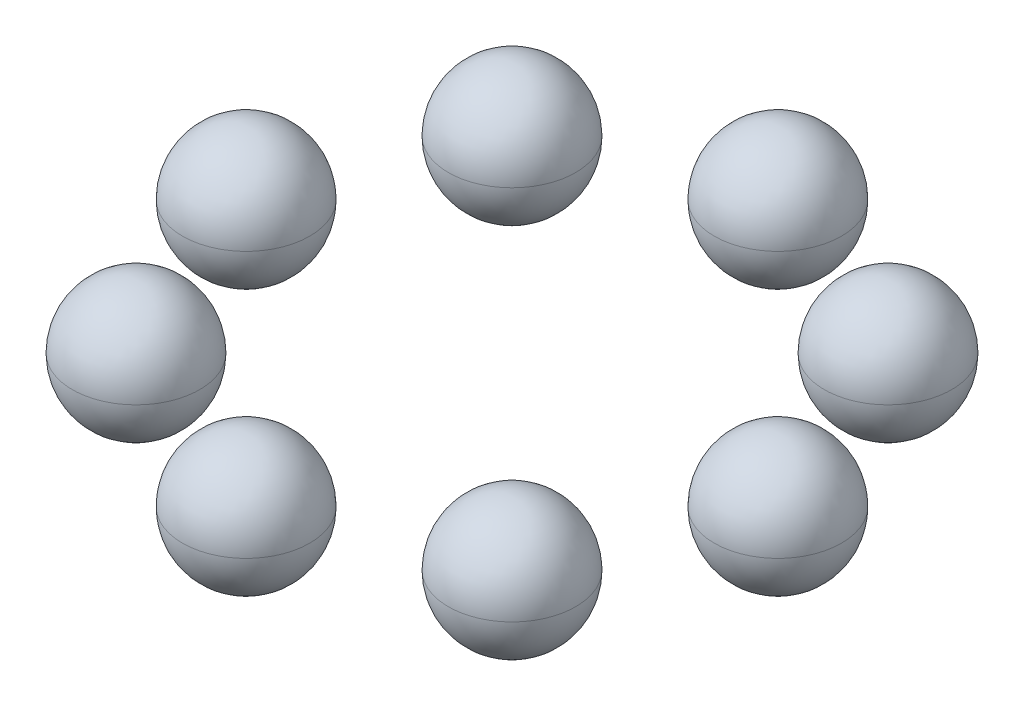
ISO-10303-21;
HEADER;
FILE_DESCRIPTION(('STEP AP214'),'2;1');
FILE_NAME('part.step','',(''),(''),'','','');
FILE_SCHEMA(('AUTOMOTIVE_DESIGN { 1 0 10303 214 1 1 1 1 }'));
ENDSEC;
DATA;
#1=APPLICATION_CONTEXT('core data for automotive mechanical design processes');
#2=APPLICATION_PROTOCOL_DEFINITION('international standard','automotive_design',2000,#1);
#3=PRODUCT_CONTEXT('',#1,'mechanical');
#4=PRODUCT('Part','Part','',(#3));
#5=PRODUCT_RELATED_PRODUCT_CATEGORY('part','',(#4));
#6=PRODUCT_DEFINITION_FORMATION('','',#4);
#7=PRODUCT_DEFINITION_CONTEXT('part definition',#1,'design');
#8=PRODUCT_DEFINITION('design','',#6,#7);
#9=PRODUCT_DEFINITION_SHAPE('','',#8);
#10=(LENGTH_UNIT() NAMED_UNIT(*) SI_UNIT(.MILLI.,.METRE.));
#11=(NAMED_UNIT(*) PLANE_ANGLE_UNIT() SI_UNIT($,.RADIAN.));
#12=(NAMED_UNIT(*) SI_UNIT($,.STERADIAN.) SOLID_ANGLE_UNIT());
#13=UNCERTAINTY_MEASURE_WITH_UNIT(LENGTH_MEASURE(1.E-05),#10,'distance_accuracy_value','');
#14=(GEOMETRIC_REPRESENTATION_CONTEXT(3) GLOBAL_UNCERTAINTY_ASSIGNED_CONTEXT((#13)) GLOBAL_UNIT_ASSIGNED_CONTEXT((#10,
#11,#12)) REPRESENTATION_CONTEXT('',''));
#15=CARTESIAN_POINT('',(0.,0.,0.));
#16=DIRECTION('',(0.,0.,1.));
#17=DIRECTION('',(1.,0.,0.));
#18=AXIS2_PLACEMENT_3D('',#15,#16,#17);
#19=CARTESIAN_POINT('',(-2.346056098,-0.000232812,-2.34628891));
#20=DIRECTION('',(0.,-1.,0.));
#21=DIRECTION('',(-0.707106781186548,0.,0.707106781186548));
#22=AXIS2_PLACEMENT_3D('',#19,#20,#21);
#23=SPHERICAL_SURFACE('',#22,0.794);
#24=CARTESIAN_POINT('',(-2.346056098,-0.000232812,-2.34628891));
#25=DIRECTION('',(0.,-1.,0.));
#26=DIRECTION('',(0.,0.,-1.));
#27=AXIS2_PLACEMENT_3D('',#24,#25,#26);
#28=CIRCLE('',#27,0.794);
#29=CARTESIAN_POINT('',(-2.90749888226212,-0.000232812,-2.90773169426212));
#30=VERTEX_POINT('',#29);
#31=CARTESIAN_POINT('',(-1.78461331373788,-0.000232812,-1.78484612573788));
#32=VERTEX_POINT('',#31);
#33=EDGE_CURVE('P0_E11',#30,#32,#28,.T.);
#34=ORIENTED_EDGE('',*,*,#33,.F.);
#35=CARTESIAN_POINT('',(-2.346056098,-0.000232812,-2.34628891));
#36=DIRECTION('',(0.,1.,0.));
#37=DIRECTION('',(0.,0.,1.));
#38=AXIS2_PLACEMENT_3D('',#35,#36,#37);
#39=CIRCLE('',#38,0.794);
#40=EDGE_CURVE('P0_E20',#30,#32,#39,.T.);
#41=ORIENTED_EDGE('',*,*,#40,.T.);
#42=EDGE_LOOP('',(#34,#41));
#43=FACE_BOUND('',#42,.T.);
#44=ADVANCED_FACE('P0_F16',(#43),#23,.T.);
#45=CARTESIAN_POINT('',(-2.346056098,-0.000232812,-2.34628891));
#46=DIRECTION('',(0.,-1.,0.));
#47=DIRECTION('',(-0.707106781186548,0.,0.707106781186548));
#48=AXIS2_PLACEMENT_3D('',#45,#46,#47);
#49=SPHERICAL_SURFACE('',#48,0.794);
#50=ORIENTED_EDGE('',*,*,#40,.F.);
#51=ORIENTED_EDGE('',*,*,#33,.T.);
#52=EDGE_LOOP('',(#50,#51));
#53=FACE_BOUND('',#52,.T.);
#54=ADVANCED_FACE('P0_F18',(#53),#49,.T.);
#55=CLOSED_SHELL('',(#44,#54));
#56=MANIFOLD_SOLID_BREP('P0_B1',#55);
#57=CARTESIAN_POINT('',(0.,-0.000232812,-3.318057164));
#58=DIRECTION('',(0.,-1.,0.));
#59=DIRECTION('',(-1.,0.,0.));
#60=AXIS2_PLACEMENT_3D('',#57,#58,#59);
#61=SPHERICAL_SURFACE('',#60,0.794);
#62=CARTESIAN_POINT('',(0.,-0.000232812,-3.318057164));
#63=DIRECTION('',(0.,-1.,0.));
#64=DIRECTION('',(1.,0.,0.));
#65=AXIS2_PLACEMENT_3D('',#62,#63,#64);
#66=CIRCLE('',#65,0.794);
#67=CARTESIAN_POINT('',(0.,-0.000232812,-4.112057164));
#68=VERTEX_POINT('',#67);
#69=CARTESIAN_POINT('',(0.,-0.000232812,-2.524057164));
#70=VERTEX_POINT('',#69);
#71=EDGE_CURVE('P1_E11',#68,#70,#66,.T.);
#72=ORIENTED_EDGE('',*,*,#71,.F.);
#73=CARTESIAN_POINT('',(0.,-0.000232812,-3.318057164));
#74=DIRECTION('',(0.,1.,0.));
#75=DIRECTION('',(0.,0.,1.));
#76=AXIS2_PLACEMENT_3D('',#73,#74,#75);
#77=CIRCLE('',#76,0.794);
#78=EDGE_CURVE('P1_E24',#68,#70,#77,.T.);
#79=ORIENTED_EDGE('',*,*,#78,.T.);
#80=EDGE_LOOP('',(#72,#79));
#81=FACE_BOUND('',#80,.T.);
#82=ADVANCED_FACE('P1_F16',(#81),#61,.T.);
#83=CARTESIAN_POINT('',(0.,-0.000232812,-3.318057164));
#84=DIRECTION('',(0.,-1.,0.));
#85=DIRECTION('',(-1.,0.,0.));
#86=AXIS2_PLACEMENT_3D('',#83,#84,#85);
#87=SPHERICAL_SURFACE('',#86,0.794);
#88=ORIENTED_EDGE('',*,*,#78,.F.);
#89=ORIENTED_EDGE('',*,*,#71,.T.);
#90=EDGE_LOOP('',(#88,#89));
#91=FACE_BOUND('',#90,.T.);
#92=ADVANCED_FACE('P1_F40',(#91),#87,.T.);
#93=CLOSED_SHELL('',(#82,#92));
#94=MANIFOLD_SOLID_BREP('P1_B1',#93);
#95=CARTESIAN_POINT('',(2.346056098,-0.000232812,-2.34628891));
#96=DIRECTION('',(0.,-1.,0.));
#97=DIRECTION('',(-0.707106781186548,0.,-0.707106781186548));
#98=AXIS2_PLACEMENT_3D('',#95,#96,#97);
#99=SPHERICAL_SURFACE('',#98,0.794);
#100=CARTESIAN_POINT('',(2.346056098,-0.000232812,-2.34628891));
#101=DIRECTION('',(0.,-1.,0.));
#102=DIRECTION('',(0.,0.,-1.));
#103=AXIS2_PLACEMENT_3D('',#100,#101,#102);
#104=CIRCLE('',#103,0.794);
#105=CARTESIAN_POINT('',(2.90749888226212,-0.000232812,-2.90773169426212));
#106=VERTEX_POINT('',#105);
#107=CARTESIAN_POINT('',(1.78461331373788,-0.000232812,-1.78484612573788));
#108=VERTEX_POINT('',#107);
#109=EDGE_CURVE('P2_E11',#106,#108,#104,.T.);
#110=ORIENTED_EDGE('',*,*,#109,.F.);
#111=CARTESIAN_POINT('',(2.346056098,-0.000232812,-2.34628891));
#112=DIRECTION('',(0.,1.,0.));
#113=DIRECTION('',(0.,0.,1.));
#114=AXIS2_PLACEMENT_3D('',#111,#112,#113);
#115=CIRCLE('',#114,0.794);
#116=EDGE_CURVE('P2_E25',#106,#108,#115,.T.);
#117=ORIENTED_EDGE('',*,*,#116,.T.);
#118=EDGE_LOOP('',(#110,#117));
#119=FACE_BOUND('',#118,.T.);
#120=ADVANCED_FACE('P2_F16',(#119),#99,.T.);
#121=CARTESIAN_POINT('',(2.346056098,-0.000232812,-2.34628891));
#122=DIRECTION('',(0.,-1.,0.));
#123=DIRECTION('',(-0.707106781186548,0.,-0.707106781186548));
#124=AXIS2_PLACEMENT_3D('',#121,#122,#123);
#125=SPHERICAL_SURFACE('',#124,0.794);
#126=ORIENTED_EDGE('',*,*,#116,.F.);
#127=ORIENTED_EDGE('',*,*,#109,.T.);
#128=EDGE_LOOP('',(#126,#127));
#129=FACE_BOUND('',#128,.T.);
#130=ADVANCED_FACE('P2_F18',(#129),#125,.T.);
#131=CLOSED_SHELL('',(#120,#130));
#132=MANIFOLD_SOLID_BREP('P2_B1',#131);
#133=CARTESIAN_POINT('',(3.317824352,-0.000232812,-0.000232812));
#134=DIRECTION('',(0.,-1.,0.));
#135=DIRECTION('',(0.,0.,-1.));
#136=AXIS2_PLACEMENT_3D('',#133,#134,#135);
#137=SPHERICAL_SURFACE('',#136,0.794);
#138=CARTESIAN_POINT('',(3.317824352,-0.000232812,-0.000232812));
#139=DIRECTION('',(0.,-1.,0.));
#140=DIRECTION('',(0.,0.,-1.));
#141=AXIS2_PLACEMENT_3D('',#138,#139,#140);
#142=CIRCLE('',#141,0.794);
#143=CARTESIAN_POINT('',(4.111824352,-0.000232812,-0.000232812000000049));
#144=VERTEX_POINT('',#143);
#145=CARTESIAN_POINT('',(2.523824352,-0.000232812,-0.000232812000000049));
#146=VERTEX_POINT('',#145);
#147=EDGE_CURVE('P3_E11',#144,#146,#142,.T.);
#148=ORIENTED_EDGE('',*,*,#147,.F.);
#149=CARTESIAN_POINT('',(3.317824352,-0.000232812,-0.000232812));
#150=DIRECTION('',(0.,1.,0.));
#151=DIRECTION('',(0.,0.,1.));
#152=AXIS2_PLACEMENT_3D('',#149,#150,#151);
#153=CIRCLE('',#152,0.794);
#154=EDGE_CURVE('P3_E26',#144,#146,#153,.T.);
#155=ORIENTED_EDGE('',*,*,#154,.T.);
#156=EDGE_LOOP('',(#148,#155));
#157=FACE_BOUND('',#156,.T.);
#158=ADVANCED_FACE('P3_F16',(#157),#137,.T.);
#159=CARTESIAN_POINT('',(3.317824352,-0.000232812,-0.000232812));
#160=DIRECTION('',(0.,-1.,0.));
#161=DIRECTION('',(0.,0.,-1.));
#162=AXIS2_PLACEMENT_3D('',#159,#160,#161);
#163=SPHERICAL_SURFACE('',#162,0.794);
#164=ORIENTED_EDGE('',*,*,#154,.F.);
#165=ORIENTED_EDGE('',*,*,#147,.T.);
#166=EDGE_LOOP('',(#164,#165));
#167=FACE_BOUND('',#166,.T.);
#168=ADVANCED_FACE('P3_F18',(#167),#163,.T.);
#169=CLOSED_SHELL('',(#158,#168));
#170=MANIFOLD_SOLID_BREP('P3_B1',#169);
#171=CARTESIAN_POINT('',(2.346056098,-0.000232812,2.345823286));
#172=DIRECTION('',(0.,-1.,0.));
#173=DIRECTION('',(0.707106781186548,0.,-0.707106781186548));
#174=AXIS2_PLACEMENT_3D('',#171,#172,#173);
#175=SPHERICAL_SURFACE('',#174,0.794);
#176=CARTESIAN_POINT('',(2.346056098,-0.000232812,2.345823286));
#177=DIRECTION('',(0.,-1.,0.));
#178=DIRECTION('',(0.,0.,-1.));
#179=AXIS2_PLACEMENT_3D('',#176,#177,#178);
#180=CIRCLE('',#179,0.794);
#181=CARTESIAN_POINT('',(2.90749888226212,-0.000232812,2.90726607026212));
#182=VERTEX_POINT('',#181);
#183=CARTESIAN_POINT('',(1.78461331373788,-0.000232812,1.78438050173788));
#184=VERTEX_POINT('',#183);
#185=EDGE_CURVE('P4_E11',#182,#184,#180,.T.);
#186=ORIENTED_EDGE('',*,*,#185,.F.);
#187=CARTESIAN_POINT('',(2.346056098,-0.000232812,2.345823286));
#188=DIRECTION('',(0.,1.,0.));
#189=DIRECTION('',(0.,0.,1.));
#190=AXIS2_PLACEMENT_3D('',#187,#188,#189);
#191=CIRCLE('',#190,0.794);
#192=EDGE_CURVE('P4_E19',#182,#184,#191,.T.);
#193=ORIENTED_EDGE('',*,*,#192,.T.);
#194=EDGE_LOOP('',(#186,#193));
#195=FACE_BOUND('',#194,.T.);
#196=ADVANCED_FACE('P4_F16',(#195),#175,.T.);
#197=CARTESIAN_POINT('',(2.346056098,-0.000232812,2.345823286));
#198=DIRECTION('',(0.,-1.,0.));
#199=DIRECTION('',(0.707106781186548,0.,-0.707106781186548));
#200=AXIS2_PLACEMENT_3D('',#197,#198,#199);
#201=SPHERICAL_SURFACE('',#200,0.794);
#202=ORIENTED_EDGE('',*,*,#192,.F.);
#203=ORIENTED_EDGE('',*,*,#185,.T.);
#204=EDGE_LOOP('',(#202,#203));
#205=FACE_BOUND('',#204,.T.);
#206=ADVANCED_FACE('P4_F40',(#205),#201,.T.);
#207=CLOSED_SHELL('',(#196,#206));
#208=MANIFOLD_SOLID_BREP('P4_B1',#207);
#209=CARTESIAN_POINT('',(-0.000164623,-0.000232812,3.317659729));
#210=DIRECTION('',(0.,-1.,0.));
#211=DIRECTION('',(1.,0.,0.));
#212=AXIS2_PLACEMENT_3D('',#209,#210,#211);
#213=SPHERICAL_SURFACE('',#212,0.794);
#214=CARTESIAN_POINT('',(-0.000164623,-0.000232812,3.317659729));
#215=DIRECTION('',(0.,-1.,0.));
#216=DIRECTION('',(1.,0.,0.));
#217=AXIS2_PLACEMENT_3D('',#214,#215,#216);
#218=CIRCLE('',#217,0.794);
#219=CARTESIAN_POINT('',(-0.000164622999999952,-0.000232812,4.111659729));
#220=VERTEX_POINT('',#219);
#221=CARTESIAN_POINT('',(-0.000164622999999952,-0.000232812,2.523659729));
#222=VERTEX_POINT('',#221);
#223=EDGE_CURVE('P5_E11',#220,#222,#218,.T.);
#224=ORIENTED_EDGE('',*,*,#223,.F.);
#225=CARTESIAN_POINT('',(-0.000164623,-0.000232812,3.317659729));
#226=DIRECTION('',(0.,1.,0.));
#227=DIRECTION('',(0.,0.,1.));
#228=AXIS2_PLACEMENT_3D('',#225,#226,#227);
#229=CIRCLE('',#228,0.794);
#230=EDGE_CURVE('P5_E25',#220,#222,#229,.T.);
#231=ORIENTED_EDGE('',*,*,#230,.T.);
#232=EDGE_LOOP('',(#224,#231));
#233=FACE_BOUND('',#232,.T.);
#234=ADVANCED_FACE('P5_F16',(#233),#213,.T.);
#235=CARTESIAN_POINT('',(-0.000164623,-0.000232812,3.317659729));
#236=DIRECTION('',(0.,-1.,0.));
#237=DIRECTION('',(1.,0.,0.));
#238=AXIS2_PLACEMENT_3D('',#235,#236,#237);
#239=SPHERICAL_SURFACE('',#238,0.794);
#240=ORIENTED_EDGE('',*,*,#230,.F.);
#241=ORIENTED_EDGE('',*,*,#223,.T.);
#242=EDGE_LOOP('',(#240,#241));
#243=FACE_BOUND('',#242,.T.);
#244=ADVANCED_FACE('P5_F40',(#243),#239,.T.);
#245=CLOSED_SHELL('',(#234,#244));
#246=MANIFOLD_SOLID_BREP('P5_B1',#245);
#247=CARTESIAN_POINT('',(-2.346056098,-0.000232812,2.345823286));
#248=DIRECTION('',(0.,-1.,0.));
#249=DIRECTION('',(0.707106781186548,0.,0.707106781186548));
#250=AXIS2_PLACEMENT_3D('',#247,#248,#249);
#251=SPHERICAL_SURFACE('',#250,0.794);
#252=CARTESIAN_POINT('',(-2.346056098,-0.000232812,2.345823286));
#253=DIRECTION('',(0.,-1.,0.));
#254=DIRECTION('',(0.,0.,-1.));
#255=AXIS2_PLACEMENT_3D('',#252,#253,#254);
#256=CIRCLE('',#255,0.794);
#257=CARTESIAN_POINT('',(-2.90749888226212,-0.000232812,2.90726607026212));
#258=VERTEX_POINT('',#257);
#259=CARTESIAN_POINT('',(-1.78461331373788,-0.000232812,1.78438050173788));
#260=VERTEX_POINT('',#259);
#261=EDGE_CURVE('P6_E11',#258,#260,#256,.T.);
#262=ORIENTED_EDGE('',*,*,#261,.F.);
#263=CARTESIAN_POINT('',(-2.346056098,-0.000232812,2.345823286));
#264=DIRECTION('',(0.,1.,0.));
#265=DIRECTION('',(0.,0.,1.));
#266=AXIS2_PLACEMENT_3D('',#263,#264,#265);
#267=CIRCLE('',#266,0.794);
#268=EDGE_CURVE('P6_E25',#258,#260,#267,.T.);
#269=ORIENTED_EDGE('',*,*,#268,.T.);
#270=EDGE_LOOP('',(#262,#269));
#271=FACE_BOUND('',#270,.T.);
#272=ADVANCED_FACE('P6_F16',(#271),#251,.T.);
#273=CARTESIAN_POINT('',(-2.346056098,-0.000232812,2.345823286));
#274=DIRECTION('',(0.,-1.,0.));
#275=DIRECTION('',(0.707106781186548,0.,0.707106781186548));
#276=AXIS2_PLACEMENT_3D('',#273,#274,#275);
#277=SPHERICAL_SURFACE('',#276,0.794);
#278=ORIENTED_EDGE('',*,*,#268,.F.);
#279=ORIENTED_EDGE('',*,*,#261,.T.);
#280=EDGE_LOOP('',(#278,#279));
#281=FACE_BOUND('',#280,.T.);
#282=ADVANCED_FACE('P6_F18',(#281),#277,.T.);
#283=CLOSED_SHELL('',(#272,#282));
#284=MANIFOLD_SOLID_BREP('P6_B1',#283);
#285=CARTESIAN_POINT('',(-3.317824352,-0.000232812,-0.000232812));
#286=DIRECTION('',(0.,-1.,0.));
#287=DIRECTION('',(0.,0.,1.));
#288=AXIS2_PLACEMENT_3D('',#285,#286,#287);
#289=SPHERICAL_SURFACE('',#288,0.794);
#290=CARTESIAN_POINT('',(-3.317824352,-0.000232812,-0.000232812));
#291=DIRECTION('',(0.,-1.,0.));
#292=DIRECTION('',(0.,0.,-1.));
#293=AXIS2_PLACEMENT_3D('',#290,#291,#292);
#294=CIRCLE('',#293,0.794);
#295=CARTESIAN_POINT('',(-4.111824352,-0.000232812,-0.000232811999999952));
#296=VERTEX_POINT('',#295);
#297=CARTESIAN_POINT('',(-2.523824352,-0.000232812,-0.000232811999999952));
#298=VERTEX_POINT('',#297);
#299=EDGE_CURVE('P7_E11',#296,#298,#294,.T.);
#300=ORIENTED_EDGE('',*,*,#299,.F.);
#301=CARTESIAN_POINT('',(-3.317824352,-0.000232812,-0.000232812));
#302=DIRECTION('',(0.,1.,0.));
#303=DIRECTION('',(0.,0.,1.));
#304=AXIS2_PLACEMENT_3D('',#301,#302,#303);
#305=CIRCLE('',#304,0.794);
#306=EDGE_CURVE('P7_E19',#296,#298,#305,.T.);
#307=ORIENTED_EDGE('',*,*,#306,.T.);
#308=EDGE_LOOP('',(#300,#307));
#309=FACE_BOUND('',#308,.T.);
#310=ADVANCED_FACE('P7_F16',(#309),#289,.T.);
#311=CARTESIAN_POINT('',(-3.317824352,-0.000232812,-0.000232812));
#312=DIRECTION('',(0.,-1.,0.));
#313=DIRECTION('',(0.,0.,1.));
#314=AXIS2_PLACEMENT_3D('',#311,#312,#313);
#315=SPHERICAL_SURFACE('',#314,0.794);
#316=ORIENTED_EDGE('',*,*,#306,.F.);
#317=ORIENTED_EDGE('',*,*,#299,.T.);
#318=EDGE_LOOP('',(#316,#317));
#319=FACE_BOUND('',#318,.T.);
#320=ADVANCED_FACE('P7_F40',(#319),#315,.T.);
#321=CLOSED_SHELL('',(#310,#320));
#322=MANIFOLD_SOLID_BREP('P7_B1',#321);
#323=ADVANCED_BREP_SHAPE_REPRESENTATION('',(#18,#56,#94,#132,#170,#208,#246,#284,#322),#14);
#324=SHAPE_DEFINITION_REPRESENTATION(#9,#323);
ENDSEC;
END-ISO-10303-21;
